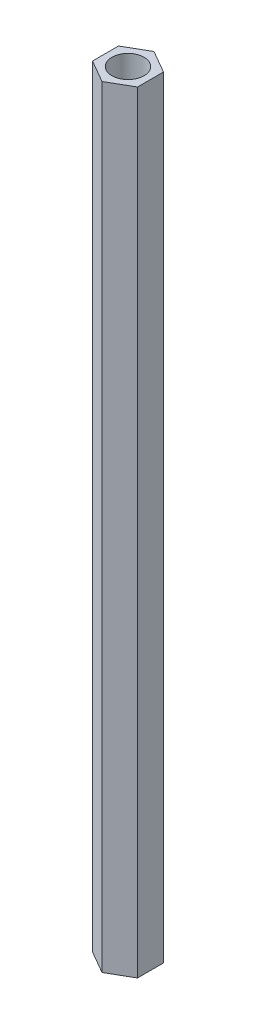
ISO-10303-21;
HEADER;
FILE_DESCRIPTION(('STEP AP214'),'2;1');
FILE_NAME('part.step','',(''),(''),'','','');
FILE_SCHEMA(('AUTOMOTIVE_DESIGN { 1 0 10303 214 1 1 1 1 }'));
ENDSEC;
DATA;
#1=APPLICATION_CONTEXT('core data for automotive mechanical design processes');
#2=APPLICATION_PROTOCOL_DEFINITION('international standard','automotive_design',2000,#1);
#3=PRODUCT_CONTEXT('',#1,'mechanical');
#4=PRODUCT('Part','Part','',(#3));
#5=PRODUCT_RELATED_PRODUCT_CATEGORY('part','',(#4));
#6=PRODUCT_DEFINITION_FORMATION('','',#4);
#7=PRODUCT_DEFINITION_CONTEXT('part definition',#1,'design');
#8=PRODUCT_DEFINITION('design','',#6,#7);
#9=PRODUCT_DEFINITION_SHAPE('','',#8);
#10=(LENGTH_UNIT() NAMED_UNIT(*) SI_UNIT(.MILLI.,.METRE.));
#11=(NAMED_UNIT(*) PLANE_ANGLE_UNIT() SI_UNIT($,.RADIAN.));
#12=(NAMED_UNIT(*) SI_UNIT($,.STERADIAN.) SOLID_ANGLE_UNIT());
#13=UNCERTAINTY_MEASURE_WITH_UNIT(LENGTH_MEASURE(1.E-05),#10,'distance_accuracy_value','');
#14=(GEOMETRIC_REPRESENTATION_CONTEXT(3) GLOBAL_UNCERTAINTY_ASSIGNED_CONTEXT((#13)) GLOBAL_UNIT_ASSIGNED_CONTEXT((#10,
#11,#12)) REPRESENTATION_CONTEXT('',''));
#15=CARTESIAN_POINT('',(0.,0.,0.));
#16=DIRECTION('',(0.,0.,1.));
#17=DIRECTION('',(1.,0.,0.));
#18=AXIS2_PLACEMENT_3D('',#15,#16,#17);
#19=CARTESIAN_POINT('',(1.75,60.,-1.01036297108185));
#20=DIRECTION('',(-0.5,0.,0.866025403784439));
#21=DIRECTION('',(0.866025403784439,0.,0.5));
#22=AXIS2_PLACEMENT_3D('',#19,#20,#21);
#23=PLANE('',#22);
#24=DIRECTION('',(-0.866025403784439,0.,-0.5));
#25=VECTOR('',#24,1.);
#26=CARTESIAN_POINT('',(1.75,0.,-1.01036297108185));
#27=LINE('',#26,#25);
#28=CARTESIAN_POINT('',(1.75,0.,-1.01036297108185));
#29=VERTEX_POINT('',#28);
#30=CARTESIAN_POINT('',(0.,0.,-2.02072594216369));
#31=VERTEX_POINT('',#30);
#32=EDGE_CURVE('E124',#29,#31,#27,.T.);
#33=ORIENTED_EDGE('',*,*,#32,.T.);
#34=DIRECTION('',(0.,-1.,0.));
#35=VECTOR('',#34,1.);
#36=CARTESIAN_POINT('',(0.,60.,-2.02072594216369));
#37=LINE('',#36,#35);
#38=CARTESIAN_POINT('',(0.,60.,-2.02072594216369));
#39=VERTEX_POINT('',#38);
#40=EDGE_CURVE('E11',#39,#31,#37,.T.);
#41=ORIENTED_EDGE('',*,*,#40,.F.);
#42=DIRECTION('',(-0.866025403784439,0.,-0.5));
#43=VECTOR('',#42,1.);
#44=CARTESIAN_POINT('',(1.75,60.,-1.01036297108185));
#45=LINE('',#44,#43);
#46=CARTESIAN_POINT('',(1.75,60.,-1.01036297108185));
#47=VERTEX_POINT('',#46);
#48=EDGE_CURVE('E135',#47,#39,#45,.T.);
#49=ORIENTED_EDGE('',*,*,#48,.F.);
#50=DIRECTION('',(0.,-1.,0.));
#51=VECTOR('',#50,1.);
#52=CARTESIAN_POINT('',(1.75,60.,-1.01036297108185));
#53=LINE('',#52,#51);
#54=EDGE_CURVE('E120',#47,#29,#53,.T.);
#55=ORIENTED_EDGE('',*,*,#54,.T.);
#56=EDGE_LOOP('',(#33,#41,#49,#55));
#57=FACE_BOUND('',#56,.T.);
#58=ADVANCED_FACE('F37',(#57),#23,.F.);
#59=CARTESIAN_POINT('',(0.,60.,-2.02072594216369));
#60=DIRECTION('',(0.5,0.,0.866025403784439));
#61=DIRECTION('',(0.866025403784439,0.,-0.5));
#62=AXIS2_PLACEMENT_3D('',#59,#60,#61);
#63=PLANE('',#62);
#64=DIRECTION('',(-0.866025403784439,0.,0.5));
#65=VECTOR('',#64,1.);
#66=CARTESIAN_POINT('',(0.,0.,-2.02072594216369));
#67=LINE('',#66,#65);
#68=CARTESIAN_POINT('',(-1.75,0.,-1.01036297108185));
#69=VERTEX_POINT('',#68);
#70=EDGE_CURVE('E127',#31,#69,#67,.T.);
#71=ORIENTED_EDGE('',*,*,#70,.T.);
#72=DIRECTION('',(0.,-1.,0.));
#73=VECTOR('',#72,1.);
#74=CARTESIAN_POINT('',(-1.75,60.,-1.01036297108185));
#75=LINE('',#74,#73);
#76=CARTESIAN_POINT('',(-1.75,60.,-1.01036297108185));
#77=VERTEX_POINT('',#76);
#78=EDGE_CURVE('E45',#77,#69,#75,.T.);
#79=ORIENTED_EDGE('',*,*,#78,.F.);
#80=DIRECTION('',(-0.866025403784439,0.,0.5));
#81=VECTOR('',#80,1.);
#82=CARTESIAN_POINT('',(0.,60.,-2.02072594216369));
#83=LINE('',#82,#81);
#84=EDGE_CURVE('E91',#39,#77,#83,.T.);
#85=ORIENTED_EDGE('',*,*,#84,.F.);
#86=ORIENTED_EDGE('',*,*,#40,.T.);
#87=EDGE_LOOP('',(#71,#79,#85,#86));
#88=FACE_BOUND('',#87,.T.);
#89=ADVANCED_FACE('F160',(#88),#63,.F.);
#90=CARTESIAN_POINT('',(-1.75,60.,-1.01036297108185));
#91=DIRECTION('',(1.,0.,0.));
#92=DIRECTION('',(0.,0.,-1.));
#93=AXIS2_PLACEMENT_3D('',#90,#91,#92);
#94=PLANE('',#93);
#95=DIRECTION('',(0.,0.,1.));
#96=VECTOR('',#95,1.);
#97=CARTESIAN_POINT('',(-1.75,0.,-1.01036297108185));
#98=LINE('',#97,#96);
#99=CARTESIAN_POINT('',(-1.75,0.,1.01036297108184));
#100=VERTEX_POINT('',#99);
#101=EDGE_CURVE('E130',#69,#100,#98,.T.);
#102=ORIENTED_EDGE('',*,*,#101,.T.);
#103=DIRECTION('',(0.,-1.,0.));
#104=VECTOR('',#103,1.);
#105=CARTESIAN_POINT('',(-1.75,60.,1.01036297108184));
#106=LINE('',#105,#104);
#107=CARTESIAN_POINT('',(-1.75,60.,1.01036297108184));
#108=VERTEX_POINT('',#107);
#109=EDGE_CURVE('E115',#108,#100,#106,.T.);
#110=ORIENTED_EDGE('',*,*,#109,.F.);
#111=DIRECTION('',(0.,0.,1.));
#112=VECTOR('',#111,1.);
#113=CARTESIAN_POINT('',(-1.75,60.,-1.01036297108185));
#114=LINE('',#113,#112);
#115=EDGE_CURVE('E106',#77,#108,#114,.T.);
#116=ORIENTED_EDGE('',*,*,#115,.F.);
#117=ORIENTED_EDGE('',*,*,#78,.T.);
#118=EDGE_LOOP('',(#102,#110,#116,#117));
#119=FACE_BOUND('',#118,.T.);
#120=ADVANCED_FACE('F141',(#119),#94,.F.);
#121=CARTESIAN_POINT('',(-1.75,60.,1.01036297108184));
#122=DIRECTION('',(0.5,0.,-0.866025403784439));
#123=DIRECTION('',(-0.866025403784439,0.,-0.5));
#124=AXIS2_PLACEMENT_3D('',#121,#122,#123);
#125=PLANE('',#124);
#126=DIRECTION('',(0.866025403784439,0.,0.5));
#127=VECTOR('',#126,1.);
#128=CARTESIAN_POINT('',(-1.75,0.,1.01036297108184));
#129=LINE('',#128,#127);
#130=CARTESIAN_POINT('',(0.,0.,2.02072594216369));
#131=VERTEX_POINT('',#130);
#132=EDGE_CURVE('E114',#100,#131,#129,.T.);
#133=ORIENTED_EDGE('',*,*,#132,.T.);
#134=DIRECTION('',(0.,-1.,0.));
#135=VECTOR('',#134,1.);
#136=CARTESIAN_POINT('',(0.,60.,2.02072594216369));
#137=LINE('',#136,#135);
#138=CARTESIAN_POINT('',(0.,60.,2.02072594216369));
#139=VERTEX_POINT('',#138);
#140=EDGE_CURVE('E111',#139,#131,#137,.T.);
#141=ORIENTED_EDGE('',*,*,#140,.F.);
#142=DIRECTION('',(0.866025403784439,0.,0.5));
#143=VECTOR('',#142,1.);
#144=CARTESIAN_POINT('',(-1.75,60.,1.01036297108184));
#145=LINE('',#144,#143);
#146=EDGE_CURVE('E100',#108,#139,#145,.T.);
#147=ORIENTED_EDGE('',*,*,#146,.F.);
#148=ORIENTED_EDGE('',*,*,#109,.T.);
#149=EDGE_LOOP('',(#133,#141,#147,#148));
#150=FACE_BOUND('',#149,.T.);
#151=ADVANCED_FACE('F112',(#150),#125,.F.);
#152=CARTESIAN_POINT('',(0.,60.,2.02072594216369));
#153=DIRECTION('',(-0.5,0.,-0.866025403784439));
#154=DIRECTION('',(-0.866025403784439,0.,0.5));
#155=AXIS2_PLACEMENT_3D('',#152,#153,#154);
#156=PLANE('',#155);
#157=DIRECTION('',(0.866025403784439,0.,-0.5));
#158=VECTOR('',#157,1.);
#159=CARTESIAN_POINT('',(0.,0.,2.02072594216369));
#160=LINE('',#159,#158);
#161=CARTESIAN_POINT('',(1.75,0.,1.01036297108185));
#162=VERTEX_POINT('',#161);
#163=EDGE_CURVE('E77',#131,#162,#160,.T.);
#164=ORIENTED_EDGE('',*,*,#163,.T.);
#165=DIRECTION('',(0.,-1.,0.));
#166=VECTOR('',#165,1.);
#167=CARTESIAN_POINT('',(1.75,60.,1.01036297108185));
#168=LINE('',#167,#166);
#169=CARTESIAN_POINT('',(1.75,60.,1.01036297108185));
#170=VERTEX_POINT('',#169);
#171=EDGE_CURVE('E116',#170,#162,#168,.T.);
#172=ORIENTED_EDGE('',*,*,#171,.F.);
#173=DIRECTION('',(0.866025403784439,0.,-0.5));
#174=VECTOR('',#173,1.);
#175=CARTESIAN_POINT('',(0.,60.,2.02072594216369));
#176=LINE('',#175,#174);
#177=EDGE_CURVE('E104',#139,#170,#176,.T.);
#178=ORIENTED_EDGE('',*,*,#177,.F.);
#179=ORIENTED_EDGE('',*,*,#140,.T.);
#180=EDGE_LOOP('',(#164,#172,#178,#179));
#181=FACE_BOUND('',#180,.T.);
#182=ADVANCED_FACE('F118',(#181),#156,.F.);
#183=CARTESIAN_POINT('',(1.75,60.,1.01036297108185));
#184=DIRECTION('',(-1.,0.,0.));
#185=DIRECTION('',(0.,0.,1.));
#186=AXIS2_PLACEMENT_3D('',#183,#184,#185);
#187=PLANE('',#186);
#188=DIRECTION('',(0.,0.,-1.));
#189=VECTOR('',#188,1.);
#190=CARTESIAN_POINT('',(1.75,0.,1.01036297108185));
#191=LINE('',#190,#189);
#192=EDGE_CURVE('E83',#162,#29,#191,.T.);
#193=ORIENTED_EDGE('',*,*,#192,.T.);
#194=ORIENTED_EDGE('',*,*,#54,.F.);
#195=DIRECTION('',(0.,0.,-1.));
#196=VECTOR('',#195,1.);
#197=CARTESIAN_POINT('',(1.75,60.,1.01036297108185));
#198=LINE('',#197,#196);
#199=EDGE_CURVE('E53',#170,#47,#198,.T.);
#200=ORIENTED_EDGE('',*,*,#199,.F.);
#201=ORIENTED_EDGE('',*,*,#171,.T.);
#202=EDGE_LOOP('',(#193,#194,#200,#201));
#203=FACE_BOUND('',#202,.T.);
#204=ADVANCED_FACE('F148',(#203),#187,.F.);
#205=CARTESIAN_POINT('',(0.,60.,0.));
#206=DIRECTION('',(0.,1.,0.));
#207=DIRECTION('',(0.,0.,1.));
#208=AXIS2_PLACEMENT_3D('',#205,#206,#207);
#209=PLANE('',#208);
#210=CARTESIAN_POINT('',(0.,60.,0.));
#211=DIRECTION('',(0.,1.,0.));
#212=DIRECTION('',(0.,0.,1.));
#213=AXIS2_PLACEMENT_3D('',#210,#211,#212);
#214=CIRCLE('',#213,1.24999999999999);
#215=CARTESIAN_POINT('',(0.,60.,1.24999999999999));
#216=VERTEX_POINT('',#215);
#217=EDGE_CURVE('E248',#216,#216,#214,.T.);
#218=ORIENTED_EDGE('',*,*,#217,.F.);
#219=EDGE_LOOP('',(#218));
#220=FACE_BOUND('',#219,.T.);
#221=ORIENTED_EDGE('',*,*,#48,.T.);
#222=ORIENTED_EDGE('',*,*,#84,.T.);
#223=ORIENTED_EDGE('',*,*,#115,.T.);
#224=ORIENTED_EDGE('',*,*,#146,.T.);
#225=ORIENTED_EDGE('',*,*,#177,.T.);
#226=ORIENTED_EDGE('',*,*,#199,.T.);
#227=EDGE_LOOP('',(#221,#222,#223,#224,#225,#226));
#228=FACE_BOUND('',#227,.T.);
#229=ADVANCED_FACE('F102',(#220,#228),#209,.T.);
#230=CARTESIAN_POINT('',(0.,0.,0.));
#231=DIRECTION('',(0.,1.,0.));
#232=DIRECTION('',(0.,0.,1.));
#233=AXIS2_PLACEMENT_3D('',#230,#231,#232);
#234=PLANE('',#233);
#235=CARTESIAN_POINT('',(0.,0.,0.));
#236=DIRECTION('',(0.,-1.,0.));
#237=DIRECTION('',(0.,0.,-1.));
#238=AXIS2_PLACEMENT_3D('',#235,#236,#237);
#239=CIRCLE('',#238,1.24999999999999);
#240=CARTESIAN_POINT('',(0.,0.,-1.24999999999999));
#241=VERTEX_POINT('',#240);
#242=EDGE_CURVE('E246',#241,#241,#239,.T.);
#243=ORIENTED_EDGE('',*,*,#242,.F.);
#244=EDGE_LOOP('',(#243));
#245=FACE_BOUND('',#244,.T.);
#246=ORIENTED_EDGE('',*,*,#32,.F.);
#247=ORIENTED_EDGE('',*,*,#192,.F.);
#248=ORIENTED_EDGE('',*,*,#163,.F.);
#249=ORIENTED_EDGE('',*,*,#132,.F.);
#250=ORIENTED_EDGE('',*,*,#101,.F.);
#251=ORIENTED_EDGE('',*,*,#70,.F.);
#252=EDGE_LOOP('',(#246,#247,#248,#249,#250,#251));
#253=FACE_BOUND('',#252,.T.);
#254=ADVANCED_FACE('F144',(#245,#253),#234,.F.);
#255=CARTESIAN_POINT('',(0.,50.,0.));
#256=DIRECTION('',(0.,1.,0.));
#257=DIRECTION('',(0.,0.,1.));
#258=AXIS2_PLACEMENT_3D('',#255,#256,#257);
#259=CONICAL_SURFACE('',#258,1.25,1.02974425867665);
#260=CARTESIAN_POINT('',(0.,49.2489242262155,0.));
#261=VERTEX_POINT('',#260);
#262=VERTEX_LOOP('',#261);
#263=FACE_BOUND('',#262,.T.);
#264=CARTESIAN_POINT('',(0.,50.,0.));
#265=DIRECTION('',(0.,1.,0.));
#266=DIRECTION('',(0.,0.,1.));
#267=AXIS2_PLACEMENT_3D('',#264,#265,#266);
#268=CIRCLE('',#267,1.25);
#269=CARTESIAN_POINT('',(0.,50.,1.25));
#270=VERTEX_POINT('',#269);
#271=EDGE_CURVE('E128',#270,#270,#268,.T.);
#272=ORIENTED_EDGE('',*,*,#271,.T.);
#273=EDGE_LOOP('',(#272));
#274=FACE_BOUND('',#273,.T.);
#275=ADVANCED_FACE('F195',(#263,#274),#259,.F.);
#276=CARTESIAN_POINT('',(0.,60.,0.));
#277=DIRECTION('',(0.,1.,0.));
#278=DIRECTION('',(0.,0.,1.));
#279=AXIS2_PLACEMENT_3D('',#276,#277,#278);
#280=CYLINDRICAL_SURFACE('',#279,1.24999999999999);
#281=ORIENTED_EDGE('',*,*,#271,.F.);
#282=EDGE_LOOP('',(#281));
#283=FACE_BOUND('',#282,.T.);
#284=ORIENTED_EDGE('',*,*,#217,.T.);
#285=EDGE_LOOP('',(#284));
#286=FACE_BOUND('',#285,.T.);
#287=ADVANCED_FACE('F200',(#283,#286),#280,.F.);
#288=CARTESIAN_POINT('',(0.,9.99999999999999,0.));
#289=DIRECTION('',(0.,-1.,0.));
#290=DIRECTION('',(0.,0.,-1.));
#291=AXIS2_PLACEMENT_3D('',#288,#289,#290);
#292=CONICAL_SURFACE('',#291,1.24999999999999,1.02974425867665);
#293=CARTESIAN_POINT('',(0.,10.7510757737845,0.));
#294=VERTEX_POINT('',#293);
#295=VERTEX_LOOP('',#294);
#296=FACE_BOUND('',#295,.T.);
#297=CARTESIAN_POINT('',(0.,9.99999999999999,0.));
#298=DIRECTION('',(0.,-1.,0.));
#299=DIRECTION('',(0.,0.,-1.));
#300=AXIS2_PLACEMENT_3D('',#297,#298,#299);
#301=CIRCLE('',#300,1.24999999999999);
#302=CARTESIAN_POINT('',(0.,9.99999999999999,-1.24999999999999));
#303=VERTEX_POINT('',#302);
#304=EDGE_CURVE('E243',#303,#303,#301,.T.);
#305=ORIENTED_EDGE('',*,*,#304,.T.);
#306=EDGE_LOOP('',(#305));
#307=FACE_BOUND('',#306,.T.);
#308=ADVANCED_FACE('F210',(#296,#307),#292,.F.);
#309=CARTESIAN_POINT('',(0.,0.,0.));
#310=DIRECTION('',(0.,-1.,0.));
#311=DIRECTION('',(0.,0.,-1.));
#312=AXIS2_PLACEMENT_3D('',#309,#310,#311);
#313=CYLINDRICAL_SURFACE('',#312,1.24999999999999);
#314=ORIENTED_EDGE('',*,*,#304,.F.);
#315=EDGE_LOOP('',(#314));
#316=FACE_BOUND('',#315,.T.);
#317=ORIENTED_EDGE('',*,*,#242,.T.);
#318=EDGE_LOOP('',(#317));
#319=FACE_BOUND('',#318,.T.);
#320=ADVANCED_FACE('F226',(#316,#319),#313,.F.);
#321=CLOSED_SHELL('',(#58,#89,#120,#151,#182,#204,#229,#254,#275,#287,#308,#320));
#322=MANIFOLD_SOLID_BREP('B2',#321);
#323=ADVANCED_BREP_SHAPE_REPRESENTATION('',(#18,#322),#14);
#324=SHAPE_DEFINITION_REPRESENTATION(#9,#323);
ENDSEC;
END-ISO-10303-21;
